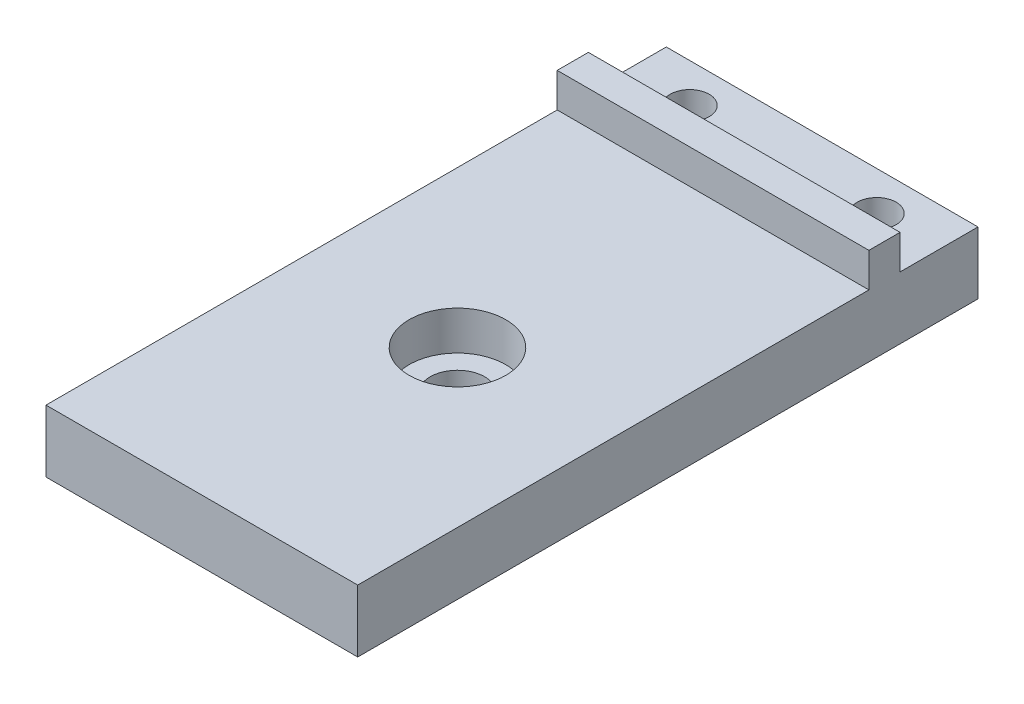
ISO-10303-21;
HEADER;
FILE_DESCRIPTION(('STEP AP214'),'2;1');
FILE_NAME('part.step','',(''),(''),'','','');
FILE_SCHEMA(('AUTOMOTIVE_DESIGN { 1 0 10303 214 1 1 1 1 }'));
ENDSEC;
DATA;
#1=APPLICATION_CONTEXT('core data for automotive mechanical design processes');
#2=APPLICATION_PROTOCOL_DEFINITION('international standard','automotive_design',2000,#1);
#3=PRODUCT_CONTEXT('',#1,'mechanical');
#4=PRODUCT('Part','Part','',(#3));
#5=PRODUCT_RELATED_PRODUCT_CATEGORY('part','',(#4));
#6=PRODUCT_DEFINITION_FORMATION('','',#4);
#7=PRODUCT_DEFINITION_CONTEXT('part definition',#1,'design');
#8=PRODUCT_DEFINITION('design','',#6,#7);
#9=PRODUCT_DEFINITION_SHAPE('','',#8);
#10=(LENGTH_UNIT() NAMED_UNIT(*) SI_UNIT(.MILLI.,.METRE.));
#11=(NAMED_UNIT(*) PLANE_ANGLE_UNIT() SI_UNIT($,.RADIAN.));
#12=(NAMED_UNIT(*) SI_UNIT($,.STERADIAN.) SOLID_ANGLE_UNIT());
#13=UNCERTAINTY_MEASURE_WITH_UNIT(LENGTH_MEASURE(1.E-05),#10,'distance_accuracy_value','');
#14=(GEOMETRIC_REPRESENTATION_CONTEXT(3) GLOBAL_UNCERTAINTY_ASSIGNED_CONTEXT((#13)) GLOBAL_UNIT_ASSIGNED_CONTEXT((#10,
#11,#12)) REPRESENTATION_CONTEXT('',''));
#15=CARTESIAN_POINT('',(0.,0.,0.));
#16=DIRECTION('',(0.,0.,1.));
#17=DIRECTION('',(1.,0.,0.));
#18=AXIS2_PLACEMENT_3D('',#15,#16,#17);
#19=CARTESIAN_POINT('',(16.,6.2,-4.5));
#20=DIRECTION('',(0.,-1.,0.));
#21=DIRECTION('',(0.,0.,-1.));
#22=AXIS2_PLACEMENT_3D('',#19,#20,#21);
#23=CYLINDRICAL_SURFACE('',#22,1.25);
#24=CARTESIAN_POINT('',(16.,4.,-4.5));
#25=DIRECTION('',(0.,-1.,0.));
#26=DIRECTION('',(1.,0.,0.));
#27=AXIS2_PLACEMENT_3D('',#24,#25,#26);
#28=CIRCLE('',#27,1.25);
#29=CARTESIAN_POINT('',(17.25,4.,-4.5));
#30=VERTEX_POINT('',#29);
#31=EDGE_CURVE('E231',#30,#30,#28,.T.);
#32=ORIENTED_EDGE('',*,*,#31,.F.);
#33=EDGE_LOOP('',(#32));
#34=FACE_BOUND('',#33,.T.);
#35=CARTESIAN_POINT('',(16.,1.5,-4.5));
#36=DIRECTION('',(0.,-1.,0.));
#37=DIRECTION('',(0.,0.,-1.));
#38=AXIS2_PLACEMENT_3D('',#35,#36,#37);
#39=CIRCLE('',#38,1.25);
#40=CARTESIAN_POINT('',(16.,1.5,-5.75));
#41=VERTEX_POINT('',#40);
#42=EDGE_CURVE('E235',#41,#41,#39,.F.);
#43=ORIENTED_EDGE('',*,*,#42,.F.);
#44=EDGE_LOOP('',(#43));
#45=FACE_BOUND('',#44,.T.);
#46=ADVANCED_FACE('F96',(#34,#45),#23,.F.);
#47=CARTESIAN_POINT('',(4.,6.2,-4.5));
#48=DIRECTION('',(0.,-1.,0.));
#49=DIRECTION('',(0.,0.,-1.));
#50=AXIS2_PLACEMENT_3D('',#47,#48,#49);
#51=CYLINDRICAL_SURFACE('',#50,1.25);
#52=CARTESIAN_POINT('',(4.,4.,-4.5));
#53=DIRECTION('',(0.,-1.,0.));
#54=DIRECTION('',(1.,0.,0.));
#55=AXIS2_PLACEMENT_3D('',#52,#53,#54);
#56=CIRCLE('',#55,1.25);
#57=CARTESIAN_POINT('',(5.25,4.,-4.5));
#58=VERTEX_POINT('',#57);
#59=EDGE_CURVE('E234',#58,#58,#56,.T.);
#60=ORIENTED_EDGE('',*,*,#59,.F.);
#61=EDGE_LOOP('',(#60));
#62=FACE_BOUND('',#61,.T.);
#63=CARTESIAN_POINT('',(4.,1.5,-4.5));
#64=DIRECTION('',(0.,-1.,0.));
#65=DIRECTION('',(0.,0.,-1.));
#66=AXIS2_PLACEMENT_3D('',#63,#64,#65);
#67=CIRCLE('',#66,1.25);
#68=CARTESIAN_POINT('',(4.,1.5,-5.75));
#69=VERTEX_POINT('',#68);
#70=EDGE_CURVE('E238',#69,#69,#67,.F.);
#71=ORIENTED_EDGE('',*,*,#70,.F.);
#72=EDGE_LOOP('',(#71));
#73=FACE_BOUND('',#72,.T.);
#74=ADVANCED_FACE('F247',(#62,#73),#51,.F.);
#75=CARTESIAN_POINT('',(0.,0.,-2.));
#76=DIRECTION('',(0.,0.,1.));
#77=DIRECTION('',(1.,0.,0.));
#78=AXIS2_PLACEMENT_3D('',#75,#76,#77);
#79=PLANE('',#78);
#80=DIRECTION('',(1.,0.,0.));
#81=VECTOR('',#80,1.);
#82=CARTESIAN_POINT('',(0.,4.,-2.));
#83=LINE('',#82,#81);
#84=CARTESIAN_POINT('',(0.,4.,-2.));
#85=VERTEX_POINT('',#84);
#86=CARTESIAN_POINT('',(20.,4.,-2.));
#87=VERTEX_POINT('',#86);
#88=EDGE_CURVE('E113',#85,#87,#83,.T.);
#89=ORIENTED_EDGE('',*,*,#88,.F.);
#90=DIRECTION('',(0.,-1.,0.));
#91=VECTOR('',#90,1.);
#92=CARTESIAN_POINT('',(0.,6.2,-2.));
#93=LINE('',#92,#91);
#94=CARTESIAN_POINT('',(0.,6.2,-2.));
#95=VERTEX_POINT('',#94);
#96=EDGE_CURVE('E204',#95,#85,#93,.T.);
#97=ORIENTED_EDGE('',*,*,#96,.F.);
#98=DIRECTION('',(-1.,0.,0.));
#99=VECTOR('',#98,1.);
#100=CARTESIAN_POINT('',(20.,6.2,-2.));
#101=LINE('',#100,#99);
#102=CARTESIAN_POINT('',(20.,6.2,-2.));
#103=VERTEX_POINT('',#102);
#104=EDGE_CURVE('E201',#103,#95,#101,.T.);
#105=ORIENTED_EDGE('',*,*,#104,.F.);
#106=DIRECTION('',(0.,-1.,0.));
#107=VECTOR('',#106,1.);
#108=CARTESIAN_POINT('',(20.,6.2,-2.));
#109=LINE('',#108,#107);
#110=EDGE_CURVE('E207',#103,#87,#109,.T.);
#111=ORIENTED_EDGE('',*,*,#110,.T.);
#112=EDGE_LOOP('',(#89,#97,#105,#111));
#113=FACE_BOUND('',#112,.T.);
#114=ADVANCED_FACE('F253',(#113),#79,.F.);
#115=CARTESIAN_POINT('',(0.,4.,0.));
#116=DIRECTION('',(1.,0.,0.));
#117=DIRECTION('',(0.,0.,-1.));
#118=AXIS2_PLACEMENT_3D('',#115,#116,#117);
#119=PLANE('',#118);
#120=DIRECTION('',(0.,0.,1.));
#121=VECTOR('',#120,1.);
#122=CARTESIAN_POINT('',(0.,4.,0.));
#123=LINE('',#122,#121);
#124=CARTESIAN_POINT('',(0.,4.,0.));
#125=VERTEX_POINT('',#124);
#126=CARTESIAN_POINT('',(0.,4.,32.7999999999999));
#127=VERTEX_POINT('',#126);
#128=EDGE_CURVE('E122',#125,#127,#123,.T.);
#129=ORIENTED_EDGE('',*,*,#128,.F.);
#130=DIRECTION('',(0.,-1.,0.));
#131=VECTOR('',#130,1.);
#132=CARTESIAN_POINT('',(0.,6.2,0.));
#133=LINE('',#132,#131);
#134=CARTESIAN_POINT('',(0.,6.2,0.));
#135=VERTEX_POINT('',#134);
#136=EDGE_CURVE('E196',#135,#125,#133,.T.);
#137=ORIENTED_EDGE('',*,*,#136,.F.);
#138=DIRECTION('',(0.,0.,1.));
#139=VECTOR('',#138,1.);
#140=CARTESIAN_POINT('',(0.,6.2,-2.));
#141=LINE('',#140,#139);
#142=EDGE_CURVE('E208',#95,#135,#141,.T.);
#143=ORIENTED_EDGE('',*,*,#142,.F.);
#144=ORIENTED_EDGE('',*,*,#96,.T.);
#145=DIRECTION('',(0.,0.,1.));
#146=VECTOR('',#145,1.);
#147=CARTESIAN_POINT('',(0.,4.,-7.));
#148=LINE('',#147,#146);
#149=CARTESIAN_POINT('',(0.,4.,-7.));
#150=VERTEX_POINT('',#149);
#151=EDGE_CURVE('E193',#150,#85,#148,.T.);
#152=ORIENTED_EDGE('',*,*,#151,.F.);
#153=DIRECTION('',(0.,1.,0.));
#154=VECTOR('',#153,1.);
#155=CARTESIAN_POINT('',(0.,0.,-7.));
#156=LINE('',#155,#154);
#157=CARTESIAN_POINT('',(0.,0.,-7.));
#158=VERTEX_POINT('',#157);
#159=EDGE_CURVE('E186',#158,#150,#156,.T.);
#160=ORIENTED_EDGE('',*,*,#159,.F.);
#161=DIRECTION('',(0.,0.,1.));
#162=VECTOR('',#161,1.);
#163=CARTESIAN_POINT('',(0.,0.,0.));
#164=LINE('',#163,#162);
#165=CARTESIAN_POINT('',(0.,0.,32.7999999999999));
#166=VERTEX_POINT('',#165);
#167=EDGE_CURVE('E135',#158,#166,#164,.T.);
#168=ORIENTED_EDGE('',*,*,#167,.T.);
#169=DIRECTION('',(0.,-1.,0.));
#170=VECTOR('',#169,1.);
#171=CARTESIAN_POINT('',(0.,4.,32.7999999999999));
#172=LINE('',#171,#170);
#173=EDGE_CURVE('E12',#127,#166,#172,.T.);
#174=ORIENTED_EDGE('',*,*,#173,.F.);
#175=EDGE_LOOP('',(#129,#137,#143,#144,#152,#160,#168,#174));
#176=FACE_BOUND('',#175,.T.);
#177=ADVANCED_FACE('F268',(#176),#119,.F.);
#178=CARTESIAN_POINT('',(0.,4.,32.7999999999999));
#179=DIRECTION('',(0.,0.,-1.));
#180=DIRECTION('',(-1.,0.,0.));
#181=AXIS2_PLACEMENT_3D('',#178,#179,#180);
#182=PLANE('',#181);
#183=DIRECTION('',(1.,0.,0.));
#184=VECTOR('',#183,1.);
#185=CARTESIAN_POINT('',(0.,0.,32.7999999999999));
#186=LINE('',#185,#184);
#187=CARTESIAN_POINT('',(20.,0.,32.7999999999999));
#188=VERTEX_POINT('',#187);
#189=EDGE_CURVE('E226',#166,#188,#186,.T.);
#190=ORIENTED_EDGE('',*,*,#189,.T.);
#191=DIRECTION('',(0.,-1.,0.));
#192=VECTOR('',#191,1.);
#193=CARTESIAN_POINT('',(20.,4.,32.7999999999999));
#194=LINE('',#193,#192);
#195=CARTESIAN_POINT('',(20.,4.,32.7999999999999));
#196=VERTEX_POINT('',#195);
#197=EDGE_CURVE('E105',#196,#188,#194,.T.);
#198=ORIENTED_EDGE('',*,*,#197,.F.);
#199=DIRECTION('',(1.,0.,0.));
#200=VECTOR('',#199,1.);
#201=CARTESIAN_POINT('',(0.,4.,32.7999999999999));
#202=LINE('',#201,#200);
#203=EDGE_CURVE('E140',#127,#196,#202,.T.);
#204=ORIENTED_EDGE('',*,*,#203,.F.);
#205=ORIENTED_EDGE('',*,*,#173,.T.);
#206=EDGE_LOOP('',(#190,#198,#204,#205));
#207=FACE_BOUND('',#206,.T.);
#208=ADVANCED_FACE('F285',(#207),#182,.F.);
#209=CARTESIAN_POINT('',(20.,4.,0.));
#210=DIRECTION('',(1.,0.,0.));
#211=DIRECTION('',(0.,0.,-1.));
#212=AXIS2_PLACEMENT_3D('',#209,#210,#211);
#213=PLANE('',#212);
#214=ORIENTED_EDGE('',*,*,#197,.T.);
#215=DIRECTION('',(0.,0.,1.));
#216=VECTOR('',#215,1.);
#217=CARTESIAN_POINT('',(20.,0.,0.));
#218=LINE('',#217,#216);
#219=CARTESIAN_POINT('',(20.,0.,-7.));
#220=VERTEX_POINT('',#219);
#221=EDGE_CURVE('E177',#220,#188,#218,.T.);
#222=ORIENTED_EDGE('',*,*,#221,.F.);
#223=DIRECTION('',(0.,-1.,0.));
#224=VECTOR('',#223,1.);
#225=CARTESIAN_POINT('',(20.,0.,-7.));
#226=LINE('',#225,#224);
#227=CARTESIAN_POINT('',(20.,4.,-7.));
#228=VERTEX_POINT('',#227);
#229=EDGE_CURVE('E171',#228,#220,#226,.T.);
#230=ORIENTED_EDGE('',*,*,#229,.F.);
#231=DIRECTION('',(0.,0.,1.));
#232=VECTOR('',#231,1.);
#233=CARTESIAN_POINT('',(20.,4.,-7.));
#234=LINE('',#233,#232);
#235=EDGE_CURVE('E176',#228,#87,#234,.T.);
#236=ORIENTED_EDGE('',*,*,#235,.T.);
#237=ORIENTED_EDGE('',*,*,#110,.F.);
#238=DIRECTION('',(0.,0.,1.));
#239=VECTOR('',#238,1.);
#240=CARTESIAN_POINT('',(20.,6.2,-2.));
#241=LINE('',#240,#239);
#242=CARTESIAN_POINT('',(20.,6.2,0.));
#243=VERTEX_POINT('',#242);
#244=EDGE_CURVE('E214',#103,#243,#241,.T.);
#245=ORIENTED_EDGE('',*,*,#244,.T.);
#246=DIRECTION('',(0.,-1.,0.));
#247=VECTOR('',#246,1.);
#248=CARTESIAN_POINT('',(20.,6.2,0.));
#249=LINE('',#248,#247);
#250=CARTESIAN_POINT('',(20.,4.,0.));
#251=VERTEX_POINT('',#250);
#252=EDGE_CURVE('E205',#243,#251,#249,.T.);
#253=ORIENTED_EDGE('',*,*,#252,.T.);
#254=DIRECTION('',(0.,0.,1.));
#255=VECTOR('',#254,1.);
#256=CARTESIAN_POINT('',(20.,4.,0.));
#257=LINE('',#256,#255);
#258=EDGE_CURVE('E220',#251,#196,#257,.T.);
#259=ORIENTED_EDGE('',*,*,#258,.T.);
#260=EDGE_LOOP('',(#214,#222,#230,#236,#237,#245,#253,#259));
#261=FACE_BOUND('',#260,.T.);
#262=ADVANCED_FACE('F98',(#261),#213,.T.);
#263=CARTESIAN_POINT('',(0.,4.,0.));
#264=DIRECTION('',(0.,-1.,0.));
#265=DIRECTION('',(0.,0.,-1.));
#266=AXIS2_PLACEMENT_3D('',#263,#264,#265);
#267=PLANE('',#266);
#268=CARTESIAN_POINT('',(10.0000000000031,4.,16.3999999999997));
#269=DIRECTION('',(0.,1.,0.));
#270=DIRECTION('',(0.,0.,1.));
#271=AXIS2_PLACEMENT_3D('',#268,#269,#270);
#272=CIRCLE('',#271,3.1);
#273=CARTESIAN_POINT('',(10.0000000000031,4.,19.4999999999997));
#274=VERTEX_POINT('',#273);
#275=EDGE_CURVE('E312',#274,#274,#272,.T.);
#276=ORIENTED_EDGE('',*,*,#275,.F.);
#277=EDGE_LOOP('',(#276));
#278=FACE_BOUND('',#277,.T.);
#279=DIRECTION('',(1.,0.,0.));
#280=VECTOR('',#279,1.);
#281=CARTESIAN_POINT('',(0.,4.,0.));
#282=LINE('',#281,#280);
#283=EDGE_CURVE('E217',#125,#251,#282,.T.);
#284=ORIENTED_EDGE('',*,*,#283,.F.);
#285=ORIENTED_EDGE('',*,*,#128,.T.);
#286=ORIENTED_EDGE('',*,*,#203,.T.);
#287=ORIENTED_EDGE('',*,*,#258,.F.);
#288=EDGE_LOOP('',(#284,#285,#286,#287));
#289=FACE_BOUND('',#288,.T.);
#290=ADVANCED_FACE('F277',(#278,#289),#267,.F.);
#291=CARTESIAN_POINT('',(0.,0.,0.));
#292=DIRECTION('',(0.,-1.,0.));
#293=DIRECTION('',(0.,0.,-1.));
#294=AXIS2_PLACEMENT_3D('',#291,#292,#293);
#295=PLANE('',#294);
#296=CARTESIAN_POINT('',(10.0000000000031,0.,16.3999999999997));
#297=DIRECTION('',(0.,1.,0.));
#298=DIRECTION('',(0.,0.,1.));
#299=AXIS2_PLACEMENT_3D('',#296,#297,#298);
#300=CIRCLE('',#299,1.75);
#301=CARTESIAN_POINT('',(10.0000000000031,0.,18.1499999999997));
#302=VERTEX_POINT('',#301);
#303=EDGE_CURVE('E317',#302,#302,#300,.T.);
#304=ORIENTED_EDGE('',*,*,#303,.T.);
#305=EDGE_LOOP('',(#304));
#306=FACE_BOUND('',#305,.T.);
#307=ORIENTED_EDGE('',*,*,#189,.F.);
#308=ORIENTED_EDGE('',*,*,#167,.F.);
#309=DIRECTION('',(-1.,0.,0.));
#310=VECTOR('',#309,1.);
#311=CARTESIAN_POINT('',(0.,0.,-7.));
#312=LINE('',#311,#310);
#313=EDGE_CURVE('E181',#220,#158,#312,.T.);
#314=ORIENTED_EDGE('',*,*,#313,.F.);
#315=ORIENTED_EDGE('',*,*,#221,.T.);
#316=EDGE_LOOP('',(#307,#308,#314,#315));
#317=FACE_BOUND('',#316,.T.);
#318=CARTESIAN_POINT('',(16.,0.,-4.5));
#319=DIRECTION('',(0.,-1.,0.));
#320=DIRECTION('',(0.,0.,-1.));
#321=AXIS2_PLACEMENT_3D('',#318,#319,#320);
#322=CIRCLE('',#321,2.);
#323=CARTESIAN_POINT('',(16.,0.,-6.5));
#324=VERTEX_POINT('',#323);
#325=EDGE_CURVE('E303',#324,#324,#322,.T.);
#326=ORIENTED_EDGE('',*,*,#325,.F.);
#327=EDGE_LOOP('',(#326));
#328=FACE_BOUND('',#327,.T.);
#329=CARTESIAN_POINT('',(4.,0.,-4.5));
#330=DIRECTION('',(0.,-1.,0.));
#331=DIRECTION('',(0.,0.,-1.));
#332=AXIS2_PLACEMENT_3D('',#329,#330,#331);
#333=CIRCLE('',#332,2.);
#334=CARTESIAN_POINT('',(4.,0.,-6.5));
#335=VERTEX_POINT('',#334);
#336=EDGE_CURVE('E307',#335,#335,#333,.T.);
#337=ORIENTED_EDGE('',*,*,#336,.F.);
#338=EDGE_LOOP('',(#337));
#339=FACE_BOUND('',#338,.T.);
#340=ADVANCED_FACE('F275',(#306,#317,#328,#339),#295,.T.);
#341=CARTESIAN_POINT('',(20.,6.2,-2.));
#342=DIRECTION('',(0.,1.,0.));
#343=DIRECTION('',(0.,0.,1.));
#344=AXIS2_PLACEMENT_3D('',#341,#342,#343);
#345=PLANE('',#344);
#346=DIRECTION('',(-1.,0.,0.));
#347=VECTOR('',#346,1.);
#348=CARTESIAN_POINT('',(20.,6.2,0.));
#349=LINE('',#348,#347);
#350=EDGE_CURVE('E192',#243,#135,#349,.T.);
#351=ORIENTED_EDGE('',*,*,#350,.F.);
#352=ORIENTED_EDGE('',*,*,#244,.F.);
#353=ORIENTED_EDGE('',*,*,#104,.T.);
#354=ORIENTED_EDGE('',*,*,#142,.T.);
#355=EDGE_LOOP('',(#351,#352,#353,#354));
#356=FACE_BOUND('',#355,.T.);
#357=ADVANCED_FACE('F271',(#356),#345,.T.);
#358=CARTESIAN_POINT('',(0.,0.,0.));
#359=DIRECTION('',(0.,0.,1.));
#360=DIRECTION('',(1.,0.,0.));
#361=AXIS2_PLACEMENT_3D('',#358,#359,#360);
#362=PLANE('',#361);
#363=ORIENTED_EDGE('',*,*,#136,.T.);
#364=ORIENTED_EDGE('',*,*,#283,.T.);
#365=ORIENTED_EDGE('',*,*,#252,.F.);
#366=ORIENTED_EDGE('',*,*,#350,.T.);
#367=EDGE_LOOP('',(#363,#364,#365,#366));
#368=FACE_BOUND('',#367,.T.);
#369=ADVANCED_FACE('F264',(#368),#362,.T.);
#370=CARTESIAN_POINT('',(0.,4.,-7.));
#371=DIRECTION('',(0.,-1.,0.));
#372=DIRECTION('',(1.,0.,0.));
#373=AXIS2_PLACEMENT_3D('',#370,#371,#372);
#374=PLANE('',#373);
#375=ORIENTED_EDGE('',*,*,#59,.T.);
#376=EDGE_LOOP('',(#375));
#377=FACE_BOUND('',#376,.T.);
#378=ORIENTED_EDGE('',*,*,#31,.T.);
#379=EDGE_LOOP('',(#378));
#380=FACE_BOUND('',#379,.T.);
#381=ORIENTED_EDGE('',*,*,#88,.T.);
#382=ORIENTED_EDGE('',*,*,#235,.F.);
#383=DIRECTION('',(1.,0.,0.));
#384=VECTOR('',#383,1.);
#385=CARTESIAN_POINT('',(0.,4.,-7.));
#386=LINE('',#385,#384);
#387=EDGE_CURVE('E182',#150,#228,#386,.T.);
#388=ORIENTED_EDGE('',*,*,#387,.F.);
#389=ORIENTED_EDGE('',*,*,#151,.T.);
#390=EDGE_LOOP('',(#381,#382,#388,#389));
#391=FACE_BOUND('',#390,.T.);
#392=ADVANCED_FACE('F191',(#377,#380,#391),#374,.F.);
#393=CARTESIAN_POINT('',(0.,0.,-7.));
#394=DIRECTION('',(0.,0.,-1.));
#395=DIRECTION('',(-1.,0.,0.));
#396=AXIS2_PLACEMENT_3D('',#393,#394,#395);
#397=PLANE('',#396);
#398=ORIENTED_EDGE('',*,*,#387,.T.);
#399=ORIENTED_EDGE('',*,*,#229,.T.);
#400=ORIENTED_EDGE('',*,*,#313,.T.);
#401=ORIENTED_EDGE('',*,*,#159,.T.);
#402=EDGE_LOOP('',(#398,#399,#400,#401));
#403=FACE_BOUND('',#402,.T.);
#404=ADVANCED_FACE('F185',(#403),#397,.T.);
#405=CARTESIAN_POINT('',(4.,1.5,-4.5));
#406=DIRECTION('',(0.,-1.,0.));
#407=DIRECTION('',(0.,0.,-1.));
#408=AXIS2_PLACEMENT_3D('',#405,#406,#407);
#409=PLANE('',#408);
#410=CARTESIAN_POINT('',(4.,1.5,-4.5));
#411=DIRECTION('',(0.,-1.,0.));
#412=DIRECTION('',(0.,0.,-1.));
#413=AXIS2_PLACEMENT_3D('',#410,#411,#412);
#414=CIRCLE('',#413,2.);
#415=CARTESIAN_POINT('',(4.,1.5,-6.5));
#416=VERTEX_POINT('',#415);
#417=EDGE_CURVE('E240',#416,#416,#414,.T.);
#418=ORIENTED_EDGE('',*,*,#417,.T.);
#419=EDGE_LOOP('',(#418));
#420=FACE_BOUND('',#419,.T.);
#421=ORIENTED_EDGE('',*,*,#70,.T.);
#422=EDGE_LOOP('',(#421));
#423=FACE_BOUND('',#422,.T.);
#424=ADVANCED_FACE('F261',(#420,#423),#409,.T.);
#425=CARTESIAN_POINT('',(4.,1.5,-4.5));
#426=DIRECTION('',(0.,-1.,0.));
#427=DIRECTION('',(0.,0.,-1.));
#428=AXIS2_PLACEMENT_3D('',#425,#426,#427);
#429=CYLINDRICAL_SURFACE('',#428,2.);
#430=ORIENTED_EDGE('',*,*,#417,.F.);
#431=EDGE_LOOP('',(#430));
#432=FACE_BOUND('',#431,.T.);
#433=ORIENTED_EDGE('',*,*,#336,.T.);
#434=EDGE_LOOP('',(#433));
#435=FACE_BOUND('',#434,.T.);
#436=ADVANCED_FACE('F347',(#432,#435),#429,.F.);
#437=CARTESIAN_POINT('',(16.,1.5,-4.5));
#438=DIRECTION('',(0.,-1.,0.));
#439=DIRECTION('',(0.,0.,-1.));
#440=AXIS2_PLACEMENT_3D('',#437,#438,#439);
#441=PLANE('',#440);
#442=CARTESIAN_POINT('',(16.,1.5,-4.5));
#443=DIRECTION('',(0.,-1.,0.));
#444=DIRECTION('',(0.,0.,-1.));
#445=AXIS2_PLACEMENT_3D('',#442,#443,#444);
#446=CIRCLE('',#445,2.);
#447=CARTESIAN_POINT('',(16.,1.5,-6.5));
#448=VERTEX_POINT('',#447);
#449=EDGE_CURVE('E300',#448,#448,#446,.T.);
#450=ORIENTED_EDGE('',*,*,#449,.T.);
#451=EDGE_LOOP('',(#450));
#452=FACE_BOUND('',#451,.T.);
#453=ORIENTED_EDGE('',*,*,#42,.T.);
#454=EDGE_LOOP('',(#453));
#455=FACE_BOUND('',#454,.T.);
#456=ADVANCED_FACE('F244',(#452,#455),#441,.T.);
#457=CARTESIAN_POINT('',(16.,1.5,-4.5));
#458=DIRECTION('',(0.,-1.,0.));
#459=DIRECTION('',(0.,0.,-1.));
#460=AXIS2_PLACEMENT_3D('',#457,#458,#459);
#461=CYLINDRICAL_SURFACE('',#460,2.);
#462=ORIENTED_EDGE('',*,*,#449,.F.);
#463=EDGE_LOOP('',(#462));
#464=FACE_BOUND('',#463,.T.);
#465=ORIENTED_EDGE('',*,*,#325,.T.);
#466=EDGE_LOOP('',(#465));
#467=FACE_BOUND('',#466,.T.);
#468=ADVANCED_FACE('F335',(#464,#467),#461,.F.);
#469=CARTESIAN_POINT('',(10.0000000000031,1.5,16.3999999999997));
#470=DIRECTION('',(0.,1.,0.));
#471=DIRECTION('',(0.,0.,1.));
#472=AXIS2_PLACEMENT_3D('',#469,#470,#471);
#473=CYLINDRICAL_SURFACE('',#472,3.1);
#474=CARTESIAN_POINT('',(10.0000000000031,1.5,16.3999999999997));
#475=DIRECTION('',(0.,1.,0.));
#476=DIRECTION('',(0.,0.,1.));
#477=AXIS2_PLACEMENT_3D('',#474,#475,#476);
#478=CIRCLE('',#477,3.1);
#479=CARTESIAN_POINT('',(10.0000000000031,1.5,19.4999999999997));
#480=VERTEX_POINT('',#479);
#481=EDGE_CURVE('E304',#480,#480,#478,.T.);
#482=ORIENTED_EDGE('',*,*,#481,.F.);
#483=EDGE_LOOP('',(#482));
#484=FACE_BOUND('',#483,.T.);
#485=ORIENTED_EDGE('',*,*,#275,.T.);
#486=EDGE_LOOP('',(#485));
#487=FACE_BOUND('',#486,.T.);
#488=ADVANCED_FACE('F329',(#484,#487),#473,.F.);
#489=CARTESIAN_POINT('',(10.0000000000031,1.5,16.3999999999997));
#490=DIRECTION('',(0.,1.,0.));
#491=DIRECTION('',(0.,0.,1.));
#492=AXIS2_PLACEMENT_3D('',#489,#490,#491);
#493=PLANE('',#492);
#494=CARTESIAN_POINT('',(10.0000000000031,1.5,16.3999999999997));
#495=DIRECTION('',(0.,1.,0.));
#496=DIRECTION('',(0.,0.,1.));
#497=AXIS2_PLACEMENT_3D('',#494,#495,#496);
#498=CIRCLE('',#497,1.75);
#499=CARTESIAN_POINT('',(10.0000000000031,1.5,18.1499999999997));
#500=VERTEX_POINT('',#499);
#501=EDGE_CURVE('E100',#500,#500,#498,.T.);
#502=ORIENTED_EDGE('',*,*,#501,.F.);
#503=EDGE_LOOP('',(#502));
#504=FACE_BOUND('',#503,.T.);
#505=ORIENTED_EDGE('',*,*,#481,.T.);
#506=EDGE_LOOP('',(#505));
#507=FACE_BOUND('',#506,.T.);
#508=ADVANCED_FACE('F326',(#504,#507),#493,.T.);
#509=CARTESIAN_POINT('',(10.0000000000031,0.,16.3999999999997));
#510=DIRECTION('',(0.,1.,0.));
#511=DIRECTION('',(0.,0.,1.));
#512=AXIS2_PLACEMENT_3D('',#509,#510,#511);
#513=CYLINDRICAL_SURFACE('',#512,1.75);
#514=ORIENTED_EDGE('',*,*,#501,.T.);
#515=EDGE_LOOP('',(#514));
#516=FACE_BOUND('',#515,.T.);
#517=ORIENTED_EDGE('',*,*,#303,.F.);
#518=EDGE_LOOP('',(#517));
#519=FACE_BOUND('',#518,.T.);
#520=ADVANCED_FACE('F323',(#516,#519),#513,.F.);
#521=CLOSED_SHELL('',(#46,#74,#114,#177,#208,#262,#290,#340,#357,#369,#392,#404,#424,#436,#456,
#468,#488,#508,#520));
#522=MANIFOLD_SOLID_BREP('B2',#521);
#523=ADVANCED_BREP_SHAPE_REPRESENTATION('',(#18,#522),#14);
#524=SHAPE_DEFINITION_REPRESENTATION(#9,#523);
ENDSEC;
END-ISO-10303-21;
